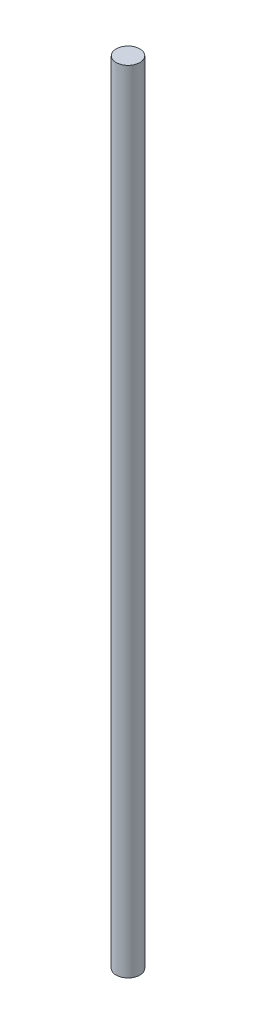
ISO-10303-21;
HEADER;
FILE_DESCRIPTION(('STEP AP214'),'2;1');
FILE_NAME('part.step','',(''),(''),'','','');
FILE_SCHEMA(('AUTOMOTIVE_DESIGN { 1 0 10303 214 1 1 1 1 }'));
ENDSEC;
DATA;
#1=APPLICATION_CONTEXT('core data for automotive mechanical design processes');
#2=APPLICATION_PROTOCOL_DEFINITION('international standard','automotive_design',2000,#1);
#3=PRODUCT_CONTEXT('',#1,'mechanical');
#4=PRODUCT('Part','Part','',(#3));
#5=PRODUCT_RELATED_PRODUCT_CATEGORY('part','',(#4));
#6=PRODUCT_DEFINITION_FORMATION('','',#4);
#7=PRODUCT_DEFINITION_CONTEXT('part definition',#1,'design');
#8=PRODUCT_DEFINITION('design','',#6,#7);
#9=PRODUCT_DEFINITION_SHAPE('','',#8);
#10=(LENGTH_UNIT() NAMED_UNIT(*) SI_UNIT(.MILLI.,.METRE.));
#11=(NAMED_UNIT(*) PLANE_ANGLE_UNIT() SI_UNIT($,.RADIAN.));
#12=(NAMED_UNIT(*) SI_UNIT($,.STERADIAN.) SOLID_ANGLE_UNIT());
#13=UNCERTAINTY_MEASURE_WITH_UNIT(LENGTH_MEASURE(1.E-05),#10,'distance_accuracy_value','');
#14=(GEOMETRIC_REPRESENTATION_CONTEXT(3) GLOBAL_UNCERTAINTY_ASSIGNED_CONTEXT((#13)) GLOBAL_UNIT_ASSIGNED_CONTEXT((#10,
#11,#12)) REPRESENTATION_CONTEXT('',''));
#15=CARTESIAN_POINT('',(0.,0.,0.));
#16=DIRECTION('',(0.,0.,1.));
#17=DIRECTION('',(1.,0.,0.));
#18=AXIS2_PLACEMENT_3D('',#15,#16,#17);
#19=CARTESIAN_POINT('',(0.,200.,1.60460868659129));
#20=DIRECTION('',(0.,-1.,0.));
#21=DIRECTION('',(0.,0.,-1.));
#22=AXIS2_PLACEMENT_3D('',#19,#20,#21);
#23=CYLINDRICAL_SURFACE('',#22,3.);
#24=CARTESIAN_POINT('',(0.,200.,1.60460868659129));
#25=DIRECTION('',(0.,1.,0.));
#26=DIRECTION('',(0.,0.,1.));
#27=AXIS2_PLACEMENT_3D('',#24,#25,#26);
#28=CIRCLE('',#27,3.);
#29=CARTESIAN_POINT('',(0.,200.,4.60460868659129));
#30=VERTEX_POINT('',#29);
#31=EDGE_CURVE('E10',#30,#30,#28,.T.);
#32=ORIENTED_EDGE('',*,*,#31,.F.);
#33=EDGE_LOOP('',(#32));
#34=FACE_BOUND('',#33,.T.);
#35=CARTESIAN_POINT('',(0.,0.,1.60460868659129));
#36=DIRECTION('',(0.,1.,0.));
#37=DIRECTION('',(0.,0.,1.));
#38=AXIS2_PLACEMENT_3D('',#35,#36,#37);
#39=CIRCLE('',#38,3.);
#40=CARTESIAN_POINT('',(0.,0.,4.60460868659129));
#41=VERTEX_POINT('',#40);
#42=EDGE_CURVE('E40',#41,#41,#39,.T.);
#43=ORIENTED_EDGE('',*,*,#42,.T.);
#44=EDGE_LOOP('',(#43));
#45=FACE_BOUND('',#44,.T.);
#46=ADVANCED_FACE('F37',(#34,#45),#23,.T.);
#47=CARTESIAN_POINT('',(0.,200.,1.60460868659129));
#48=DIRECTION('',(0.,1.,0.));
#49=DIRECTION('',(0.,0.,1.));
#50=AXIS2_PLACEMENT_3D('',#47,#48,#49);
#51=PLANE('',#50);
#52=ORIENTED_EDGE('',*,*,#31,.T.);
#53=EDGE_LOOP('',(#52));
#54=FACE_BOUND('',#53,.T.);
#55=ADVANCED_FACE('F52',(#54),#51,.T.);
#56=CARTESIAN_POINT('',(0.,0.,1.60460868659129));
#57=DIRECTION('',(0.,1.,0.));
#58=DIRECTION('',(0.,0.,1.));
#59=AXIS2_PLACEMENT_3D('',#56,#57,#58);
#60=PLANE('',#59);
#61=ORIENTED_EDGE('',*,*,#42,.F.);
#62=EDGE_LOOP('',(#61));
#63=FACE_BOUND('',#62,.T.);
#64=ADVANCED_FACE('F50',(#63),#60,.F.);
#65=CLOSED_SHELL('',(#46,#55,#64));
#66=MANIFOLD_SOLID_BREP('B2',#65);
#67=ADVANCED_BREP_SHAPE_REPRESENTATION('',(#18,#66),#14);
#68=SHAPE_DEFINITION_REPRESENTATION(#9,#67);
ENDSEC;
END-ISO-10303-21;
